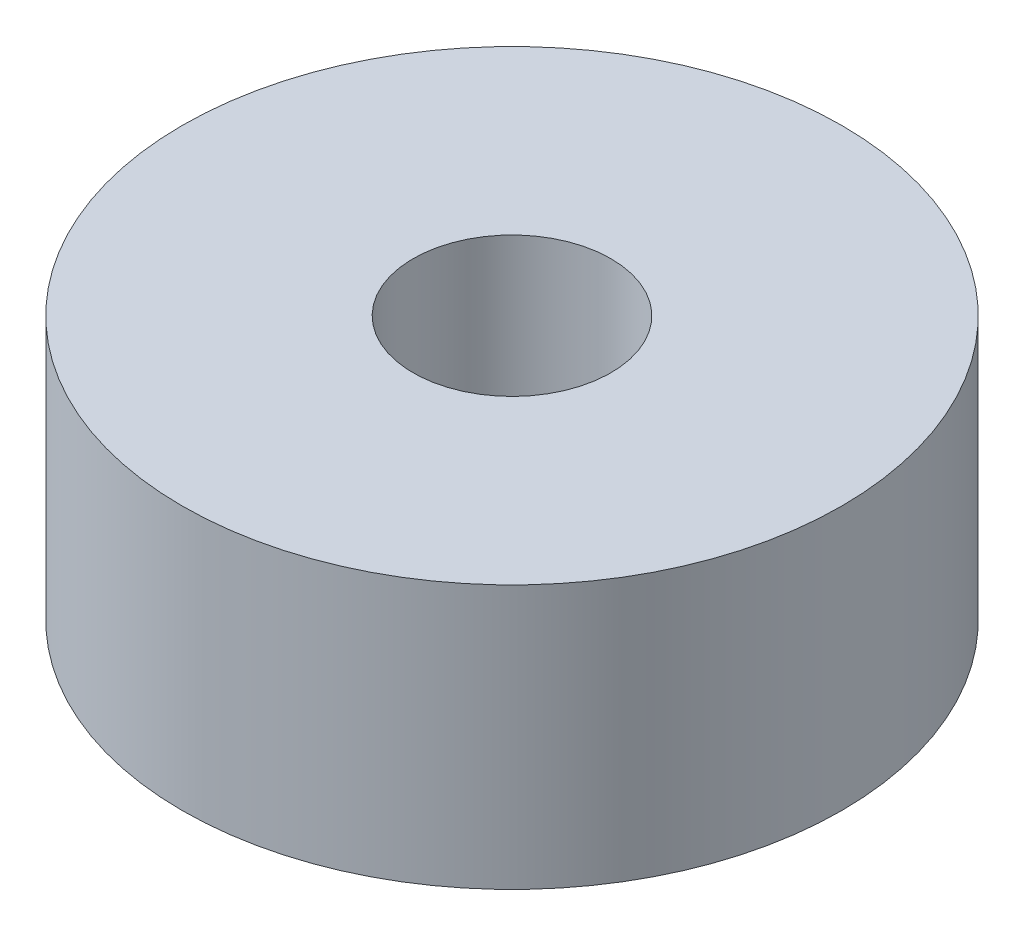
ISO-10303-21;
HEADER;
FILE_DESCRIPTION(('STEP AP214'),'2;1');
FILE_NAME('part.step','',(''),(''),'','','');
FILE_SCHEMA(('AUTOMOTIVE_DESIGN { 1 0 10303 214 1 1 1 1 }'));
ENDSEC;
DATA;
#1=APPLICATION_CONTEXT('core data for automotive mechanical design processes');
#2=APPLICATION_PROTOCOL_DEFINITION('international standard','automotive_design',2000,#1);
#3=PRODUCT_CONTEXT('',#1,'mechanical');
#4=PRODUCT('Part','Part','',(#3));
#5=PRODUCT_RELATED_PRODUCT_CATEGORY('part','',(#4));
#6=PRODUCT_DEFINITION_FORMATION('','',#4);
#7=PRODUCT_DEFINITION_CONTEXT('part definition',#1,'design');
#8=PRODUCT_DEFINITION('design','',#6,#7);
#9=PRODUCT_DEFINITION_SHAPE('','',#8);
#10=(LENGTH_UNIT() NAMED_UNIT(*) SI_UNIT(.MILLI.,.METRE.));
#11=(NAMED_UNIT(*) PLANE_ANGLE_UNIT() SI_UNIT($,.RADIAN.));
#12=(NAMED_UNIT(*) SI_UNIT($,.STERADIAN.) SOLID_ANGLE_UNIT());
#13=UNCERTAINTY_MEASURE_WITH_UNIT(LENGTH_MEASURE(1.E-05),#10,'distance_accuracy_value','');
#14=(GEOMETRIC_REPRESENTATION_CONTEXT(3) GLOBAL_UNCERTAINTY_ASSIGNED_CONTEXT((#13)) GLOBAL_UNIT_ASSIGNED_CONTEXT((#10,
#11,#12)) REPRESENTATION_CONTEXT('',''));
#15=CARTESIAN_POINT('',(0.,0.,0.));
#16=DIRECTION('',(0.,0.,1.));
#17=DIRECTION('',(1.,0.,0.));
#18=AXIS2_PLACEMENT_3D('',#15,#16,#17);
#19=CARTESIAN_POINT('',(0.,40.,0.));
#20=DIRECTION('',(0.,-1.,0.));
#21=DIRECTION('',(0.,0.,-1.));
#22=AXIS2_PLACEMENT_3D('',#19,#20,#21);
#23=CYLINDRICAL_SURFACE('',#22,50.);
#24=CARTESIAN_POINT('',(0.,40.,0.));
#25=DIRECTION('',(0.,1.,0.));
#26=DIRECTION('',(0.,0.,1.));
#27=AXIS2_PLACEMENT_3D('',#24,#25,#26);
#28=CIRCLE('',#27,50.);
#29=CARTESIAN_POINT('',(0.,40.,50.));
#30=VERTEX_POINT('',#29);
#31=EDGE_CURVE('E10',#30,#30,#28,.T.);
#32=ORIENTED_EDGE('',*,*,#31,.F.);
#33=EDGE_LOOP('',(#32));
#34=FACE_BOUND('',#33,.T.);
#35=CARTESIAN_POINT('',(0.,0.,0.));
#36=DIRECTION('',(0.,1.,0.));
#37=DIRECTION('',(0.,0.,1.));
#38=AXIS2_PLACEMENT_3D('',#35,#36,#37);
#39=CIRCLE('',#38,50.);
#40=CARTESIAN_POINT('',(0.,0.,50.));
#41=VERTEX_POINT('',#40);
#42=EDGE_CURVE('E43',#41,#41,#39,.T.);
#43=ORIENTED_EDGE('',*,*,#42,.T.);
#44=EDGE_LOOP('',(#43));
#45=FACE_BOUND('',#44,.T.);
#46=ADVANCED_FACE('F36',(#34,#45),#23,.T.);
#47=CARTESIAN_POINT('',(0.,40.,0.));
#48=DIRECTION('',(0.,1.,0.));
#49=DIRECTION('',(0.,0.,1.));
#50=AXIS2_PLACEMENT_3D('',#47,#48,#49);
#51=PLANE('',#50);
#52=CARTESIAN_POINT('',(0.,40.,0.));
#53=DIRECTION('',(0.,1.,0.));
#54=DIRECTION('',(0.,0.,1.));
#55=AXIS2_PLACEMENT_3D('',#52,#53,#54);
#56=CIRCLE('',#55,15.);
#57=CARTESIAN_POINT('',(0.,40.,-15.));
#58=VERTEX_POINT('',#57);
#59=EDGE_CURVE('E39',#58,#58,#56,.F.);
#60=ORIENTED_EDGE('',*,*,#59,.T.);
#61=EDGE_LOOP('',(#60));
#62=FACE_BOUND('',#61,.T.);
#63=ORIENTED_EDGE('',*,*,#31,.T.);
#64=EDGE_LOOP('',(#63));
#65=FACE_BOUND('',#64,.T.);
#66=ADVANCED_FACE('F56',(#62,#65),#51,.T.);
#67=CARTESIAN_POINT('',(0.,0.,0.));
#68=DIRECTION('',(0.,1.,0.));
#69=DIRECTION('',(0.,0.,1.));
#70=AXIS2_PLACEMENT_3D('',#67,#68,#69);
#71=PLANE('',#70);
#72=ORIENTED_EDGE('',*,*,#42,.F.);
#73=EDGE_LOOP('',(#72));
#74=FACE_BOUND('',#73,.T.);
#75=ADVANCED_FACE('F62',(#74),#71,.F.);
#76=CARTESIAN_POINT('',(0.,40.000012,0.));
#77=DIRECTION('',(0.,-1.,0.));
#78=DIRECTION('',(0.,0.,-1.));
#79=AXIS2_PLACEMENT_3D('',#76,#77,#78);
#80=CYLINDRICAL_SURFACE('',#79,15.);
#81=CARTESIAN_POINT('',(0.,10.,0.));
#82=DIRECTION('',(0.,1.,0.));
#83=DIRECTION('',(0.,0.,1.));
#84=AXIS2_PLACEMENT_3D('',#81,#82,#83);
#85=CIRCLE('',#84,15.);
#86=CARTESIAN_POINT('',(0.,10.,-15.));
#87=VERTEX_POINT('',#86);
#88=EDGE_CURVE('E49',#87,#87,#85,.T.);
#89=CARTESIAN_POINT('',(0.,40.,-15.));
#90=CARTESIAN_POINT('',(0.,39.6875,-15.));
#91=CARTESIAN_POINT('',(0.,39.375,-15.));
#92=CARTESIAN_POINT('',(0.,38.75,-15.));
#93=CARTESIAN_POINT('',(0.,38.4375,-15.));
#94=CARTESIAN_POINT('',(0.,37.8125,-15.));
#95=CARTESIAN_POINT('',(0.,37.5,-15.));
#96=CARTESIAN_POINT('',(0.,36.875,-15.));
#97=CARTESIAN_POINT('',(0.,36.5625,-15.));
#98=CARTESIAN_POINT('',(0.,35.9375,-15.));
#99=CARTESIAN_POINT('',(0.,35.625,-15.));
#100=CARTESIAN_POINT('',(0.,35.,-15.));
#101=CARTESIAN_POINT('',(0.,34.6875,-15.));
#102=CARTESIAN_POINT('',(0.,34.0625,-15.));
#103=CARTESIAN_POINT('',(0.,33.75,-15.));
#104=CARTESIAN_POINT('',(0.,33.125,-15.));
#105=CARTESIAN_POINT('',(0.,32.8125,-15.));
#106=CARTESIAN_POINT('',(0.,32.1875,-15.));
#107=CARTESIAN_POINT('',(0.,31.875,-15.));
#108=CARTESIAN_POINT('',(0.,31.25,-15.));
#109=CARTESIAN_POINT('',(0.,30.9375,-15.));
#110=CARTESIAN_POINT('',(0.,30.3125,-15.));
#111=CARTESIAN_POINT('',(0.,30.,-15.));
#112=CARTESIAN_POINT('',(0.,29.375,-15.));
#113=CARTESIAN_POINT('',(0.,29.0625,-15.));
#114=CARTESIAN_POINT('',(0.,28.4375,-15.));
#115=CARTESIAN_POINT('',(0.,28.125,-15.));
#116=CARTESIAN_POINT('',(0.,27.5,-15.));
#117=CARTESIAN_POINT('',(0.,27.1875,-15.));
#118=CARTESIAN_POINT('',(0.,26.5625,-15.));
#119=CARTESIAN_POINT('',(0.,26.25,-15.));
#120=CARTESIAN_POINT('',(0.,25.625,-15.));
#121=CARTESIAN_POINT('',(0.,25.3125,-15.));
#122=CARTESIAN_POINT('',(0.,24.6875,-15.));
#123=CARTESIAN_POINT('',(0.,24.375,-15.));
#124=CARTESIAN_POINT('',(0.,23.75,-15.));
#125=CARTESIAN_POINT('',(0.,23.4375,-15.));
#126=CARTESIAN_POINT('',(0.,22.8125,-15.));
#127=CARTESIAN_POINT('',(0.,22.5,-15.));
#128=CARTESIAN_POINT('',(0.,21.875,-15.));
#129=CARTESIAN_POINT('',(0.,21.5625,-15.));
#130=CARTESIAN_POINT('',(0.,20.9375,-15.));
#131=CARTESIAN_POINT('',(0.,20.625,-15.));
#132=CARTESIAN_POINT('',(0.,20.,-15.));
#133=CARTESIAN_POINT('',(0.,19.6875,-15.));
#134=CARTESIAN_POINT('',(0.,19.0625,-15.));
#135=CARTESIAN_POINT('',(0.,18.75,-15.));
#136=CARTESIAN_POINT('',(0.,18.125,-15.));
#137=CARTESIAN_POINT('',(0.,17.8125,-15.));
#138=CARTESIAN_POINT('',(0.,17.1875,-15.));
#139=CARTESIAN_POINT('',(0.,16.875,-15.));
#140=CARTESIAN_POINT('',(0.,16.25,-15.));
#141=CARTESIAN_POINT('',(0.,15.9375,-15.));
#142=CARTESIAN_POINT('',(0.,15.3125,-15.));
#143=CARTESIAN_POINT('',(0.,15.,-15.));
#144=CARTESIAN_POINT('',(0.,14.375,-15.));
#145=CARTESIAN_POINT('',(0.,14.0625,-15.));
#146=CARTESIAN_POINT('',(0.,13.4375,-15.));
#147=CARTESIAN_POINT('',(0.,13.125,-15.));
#148=CARTESIAN_POINT('',(0.,12.5,-15.));
#149=CARTESIAN_POINT('',(0.,12.1875,-15.));
#150=CARTESIAN_POINT('',(0.,11.5625,-15.));
#151=CARTESIAN_POINT('',(0.,11.25,-15.));
#152=CARTESIAN_POINT('',(0.,10.625,-15.));
#153=CARTESIAN_POINT('',(0.,10.3125,-15.));
#154=CARTESIAN_POINT('',(0.,10.,-15.));
#155=B_SPLINE_CURVE_WITH_KNOTS('',3,(#89,#90,#91,#92,#93,#94,#95,#96,#97,#98,#99,#100,#101,#102,
#103,#104,#105,#106,#107,#108,#109,#110,#111,#112,#113,#114,#115,#116,#117,#118,#119,#120,#121,
#122,#123,#124,#125,#126,#127,#128,#129,#130,#131,#132,#133,#134,#135,#136,#137,#138,#139,#140,
#141,#142,#143,#144,#145,#146,#147,#148,#149,#150,#151,#152,#153,#154),.UNSPECIFIED.,.F.,.F.,(4,
2,2,2,2,2,2,2,2,2,2,2,2,2,2,2,2,2,2,2,2,2,2,2,2,2,2,2,2,2,2,2,4),(0.,0.937500000000001,1.875,
2.8125,3.75,4.6875,5.62500000000001,6.56250000000001,7.5,8.4375,9.375,10.3125,11.25,12.1875,
13.125,14.0625,15.,15.9375,16.875,17.8125,18.75,19.6875,20.625,21.5625,22.5,23.4375,24.375,
25.3125,26.25,27.1875,28.125,29.0625,30.),.UNSPECIFIED.);
#156=EDGE_CURVE('BSEAM58',#58,#87,#155,.T.);
#157=ORIENTED_EDGE('',*,*,#59,.F.);
#158=ORIENTED_EDGE('',*,*,#88,.F.);
#159=ORIENTED_EDGE('',*,*,#156,.T.);
#160=ORIENTED_EDGE('',*,*,#156,.F.);
#161=EDGE_LOOP('',(#157,#159,#158,#160));
#162=FACE_BOUND('',#161,.T.);
#163=ADVANCED_FACE('F58',(#162),#80,.F.);
#164=CARTESIAN_POINT('',(0.,10.,0.));
#165=DIRECTION('',(0.,1.,0.));
#166=DIRECTION('',(0.,0.,1.));
#167=AXIS2_PLACEMENT_3D('',#164,#165,#166);
#168=PLANE('',#167);
#169=ORIENTED_EDGE('',*,*,#88,.T.);
#170=EDGE_LOOP('',(#169));
#171=FACE_BOUND('',#170,.T.);
#172=ADVANCED_FACE('F61',(#171),#168,.T.);
#173=CLOSED_SHELL('',(#46,#66,#75,#163,#172));
#174=MANIFOLD_SOLID_BREP('B2',#173);
#175=ADVANCED_BREP_SHAPE_REPRESENTATION('',(#18,#174),#14);
#176=SHAPE_DEFINITION_REPRESENTATION(#9,#175);
ENDSEC;
END-ISO-10303-21;
